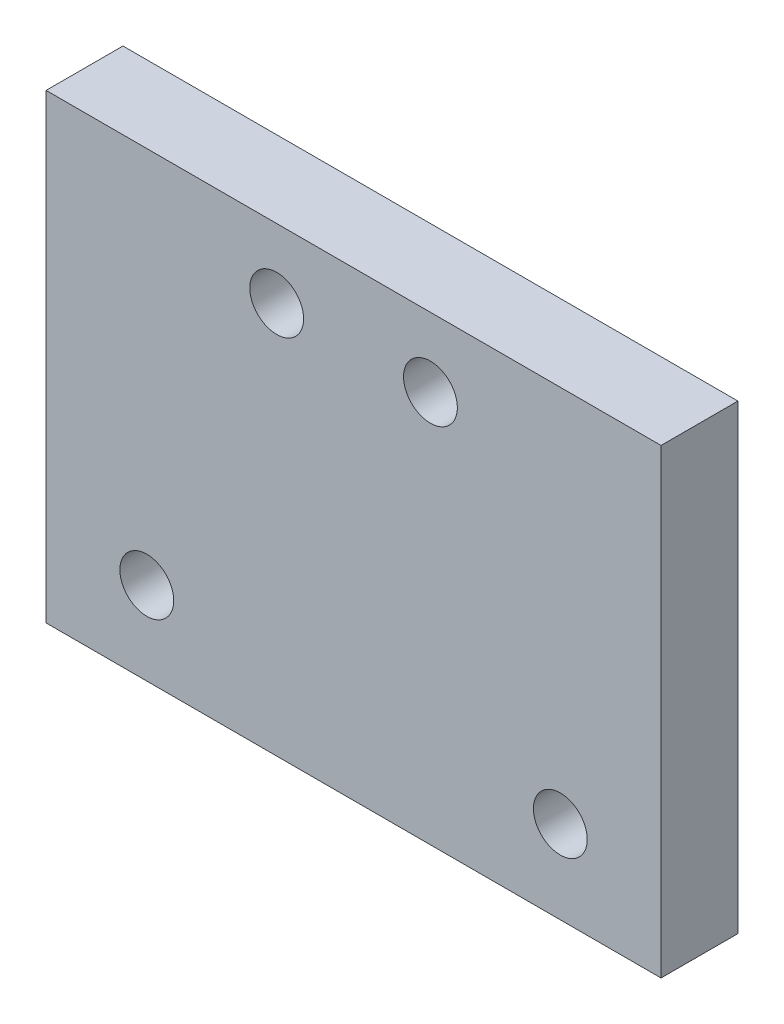
ISO-10303-21;
HEADER;
FILE_DESCRIPTION(('STEP AP214'),'2;1');
FILE_NAME('part.step','',(''),(''),'','','');
FILE_SCHEMA(('AUTOMOTIVE_DESIGN { 1 0 10303 214 1 1 1 1 }'));
ENDSEC;
DATA;
#1=APPLICATION_CONTEXT('core data for automotive mechanical design processes');
#2=APPLICATION_PROTOCOL_DEFINITION('international standard','automotive_design',2000,#1);
#3=PRODUCT_CONTEXT('',#1,'mechanical');
#4=PRODUCT('Part','Part','',(#3));
#5=PRODUCT_RELATED_PRODUCT_CATEGORY('part','',(#4));
#6=PRODUCT_DEFINITION_FORMATION('','',#4);
#7=PRODUCT_DEFINITION_CONTEXT('part definition',#1,'design');
#8=PRODUCT_DEFINITION('design','',#6,#7);
#9=PRODUCT_DEFINITION_SHAPE('','',#8);
#10=(LENGTH_UNIT() NAMED_UNIT(*) SI_UNIT(.MILLI.,.METRE.));
#11=(NAMED_UNIT(*) PLANE_ANGLE_UNIT() SI_UNIT($,.RADIAN.));
#12=(NAMED_UNIT(*) SI_UNIT($,.STERADIAN.) SOLID_ANGLE_UNIT());
#13=UNCERTAINTY_MEASURE_WITH_UNIT(LENGTH_MEASURE(1.E-05),#10,'distance_accuracy_value','');
#14=(GEOMETRIC_REPRESENTATION_CONTEXT(3) GLOBAL_UNCERTAINTY_ASSIGNED_CONTEXT((#13)) GLOBAL_UNIT_ASSIGNED_CONTEXT((#10,
#11,#12)) REPRESENTATION_CONTEXT('',''));
#15=CARTESIAN_POINT('',(0.,0.,0.));
#16=DIRECTION('',(0.,0.,1.));
#17=DIRECTION('',(1.,0.,0.));
#18=AXIS2_PLACEMENT_3D('',#15,#16,#17);
#19=CARTESIAN_POINT('',(0.,0.,-5.));
#20=DIRECTION('',(-1.,0.,0.));
#21=DIRECTION('',(0.,0.,1.));
#22=AXIS2_PLACEMENT_3D('',#19,#20,#21);
#23=PLANE('',#22);
#24=DIRECTION('',(0.,-1.,0.));
#25=VECTOR('',#24,1.);
#26=CARTESIAN_POINT('',(0.,0.,0.));
#27=LINE('',#26,#25);
#28=CARTESIAN_POINT('',(0.,30.,0.));
#29=VERTEX_POINT('',#28);
#30=CARTESIAN_POINT('',(0.,0.,0.));
#31=VERTEX_POINT('',#30);
#32=EDGE_CURVE('E101',#29,#31,#27,.T.);
#33=ORIENTED_EDGE('',*,*,#32,.F.);
#34=DIRECTION('',(0.,0.,1.));
#35=VECTOR('',#34,1.);
#36=CARTESIAN_POINT('',(0.,30.,-5.));
#37=LINE('',#36,#35);
#38=CARTESIAN_POINT('',(0.,30.,-5.));
#39=VERTEX_POINT('',#38);
#40=EDGE_CURVE('E11',#39,#29,#37,.T.);
#41=ORIENTED_EDGE('',*,*,#40,.F.);
#42=DIRECTION('',(0.,-1.,0.));
#43=VECTOR('',#42,1.);
#44=CARTESIAN_POINT('',(0.,0.,-5.));
#45=LINE('',#44,#43);
#46=CARTESIAN_POINT('',(0.,0.,-5.));
#47=VERTEX_POINT('',#46);
#48=EDGE_CURVE('E100',#39,#47,#45,.T.);
#49=ORIENTED_EDGE('',*,*,#48,.T.);
#50=DIRECTION('',(0.,0.,1.));
#51=VECTOR('',#50,1.);
#52=CARTESIAN_POINT('',(0.,0.,-5.));
#53=LINE('',#52,#51);
#54=EDGE_CURVE('E45',#47,#31,#53,.T.);
#55=ORIENTED_EDGE('',*,*,#54,.T.);
#56=EDGE_LOOP('',(#33,#41,#49,#55));
#57=FACE_BOUND('',#56,.T.);
#58=ADVANCED_FACE('F39',(#57),#23,.T.);
#59=CARTESIAN_POINT('',(0.,30.,-5.));
#60=DIRECTION('',(0.,1.,0.));
#61=DIRECTION('',(0.,0.,1.));
#62=AXIS2_PLACEMENT_3D('',#59,#60,#61);
#63=PLANE('',#62);
#64=DIRECTION('',(-1.,0.,0.));
#65=VECTOR('',#64,1.);
#66=CARTESIAN_POINT('',(0.,30.,0.));
#67=LINE('',#66,#65);
#68=CARTESIAN_POINT('',(40.,30.,0.));
#69=VERTEX_POINT('',#68);
#70=EDGE_CURVE('E98',#69,#29,#67,.T.);
#71=ORIENTED_EDGE('',*,*,#70,.F.);
#72=DIRECTION('',(0.,0.,1.));
#73=VECTOR('',#72,1.);
#74=CARTESIAN_POINT('',(40.,30.,-5.));
#75=LINE('',#74,#73);
#76=CARTESIAN_POINT('',(40.,30.,-5.));
#77=VERTEX_POINT('',#76);
#78=EDGE_CURVE('E48',#77,#69,#75,.T.);
#79=ORIENTED_EDGE('',*,*,#78,.F.);
#80=DIRECTION('',(-1.,0.,0.));
#81=VECTOR('',#80,1.);
#82=CARTESIAN_POINT('',(0.,30.,-5.));
#83=LINE('',#82,#81);
#84=EDGE_CURVE('E92',#77,#39,#83,.T.);
#85=ORIENTED_EDGE('',*,*,#84,.T.);
#86=ORIENTED_EDGE('',*,*,#40,.T.);
#87=EDGE_LOOP('',(#71,#79,#85,#86));
#88=FACE_BOUND('',#87,.T.);
#89=ADVANCED_FACE('F113',(#88),#63,.T.);
#90=CARTESIAN_POINT('',(40.,0.,-5.));
#91=DIRECTION('',(1.,0.,0.));
#92=DIRECTION('',(0.,0.,-1.));
#93=AXIS2_PLACEMENT_3D('',#90,#91,#92);
#94=PLANE('',#93);
#95=DIRECTION('',(0.,1.,0.));
#96=VECTOR('',#95,1.);
#97=CARTESIAN_POINT('',(40.,0.,0.));
#98=LINE('',#97,#96);
#99=CARTESIAN_POINT('',(40.,0.,0.));
#100=VERTEX_POINT('',#99);
#101=EDGE_CURVE('E87',#100,#69,#98,.T.);
#102=ORIENTED_EDGE('',*,*,#101,.F.);
#103=DIRECTION('',(0.,0.,1.));
#104=VECTOR('',#103,1.);
#105=CARTESIAN_POINT('',(40.,0.,-5.));
#106=LINE('',#105,#104);
#107=CARTESIAN_POINT('',(40.,0.,-5.));
#108=VERTEX_POINT('',#107);
#109=EDGE_CURVE('E84',#108,#100,#106,.T.);
#110=ORIENTED_EDGE('',*,*,#109,.F.);
#111=DIRECTION('',(0.,1.,0.));
#112=VECTOR('',#111,1.);
#113=CARTESIAN_POINT('',(40.,0.,-5.));
#114=LINE('',#113,#112);
#115=EDGE_CURVE('E90',#108,#77,#114,.T.);
#116=ORIENTED_EDGE('',*,*,#115,.T.);
#117=ORIENTED_EDGE('',*,*,#78,.T.);
#118=EDGE_LOOP('',(#102,#110,#116,#117));
#119=FACE_BOUND('',#118,.T.);
#120=ADVANCED_FACE('F86',(#119),#94,.T.);
#121=CARTESIAN_POINT('',(0.,0.,-5.));
#122=DIRECTION('',(0.,-1.,0.));
#123=DIRECTION('',(0.,0.,-1.));
#124=AXIS2_PLACEMENT_3D('',#121,#122,#123);
#125=PLANE('',#124);
#126=DIRECTION('',(1.,0.,0.));
#127=VECTOR('',#126,1.);
#128=CARTESIAN_POINT('',(0.,0.,0.));
#129=LINE('',#128,#127);
#130=EDGE_CURVE('E107',#31,#100,#129,.T.);
#131=ORIENTED_EDGE('',*,*,#130,.F.);
#132=ORIENTED_EDGE('',*,*,#54,.F.);
#133=DIRECTION('',(1.,0.,0.));
#134=VECTOR('',#133,1.);
#135=CARTESIAN_POINT('',(0.,0.,-5.));
#136=LINE('',#135,#134);
#137=EDGE_CURVE('E93',#47,#108,#136,.T.);
#138=ORIENTED_EDGE('',*,*,#137,.T.);
#139=ORIENTED_EDGE('',*,*,#109,.T.);
#140=EDGE_LOOP('',(#131,#132,#138,#139));
#141=FACE_BOUND('',#140,.T.);
#142=ADVANCED_FACE('F96',(#141),#125,.T.);
#143=CARTESIAN_POINT('',(0.,0.,-5.));
#144=DIRECTION('',(0.,0.,-1.));
#145=DIRECTION('',(-1.,0.,0.));
#146=AXIS2_PLACEMENT_3D('',#143,#144,#145);
#147=PLANE('',#146);
#148=CARTESIAN_POINT('',(33.45,5.40000000000001,-5.));
#149=DIRECTION('',(0.,0.,1.));
#150=DIRECTION('',(-1.,0.,0.));
#151=AXIS2_PLACEMENT_3D('',#148,#149,#150);
#152=CIRCLE('',#151,1.75);
#153=CARTESIAN_POINT('',(31.7,5.40000000000001,-5.));
#154=VERTEX_POINT('',#153);
#155=EDGE_CURVE('E157',#154,#154,#152,.T.);
#156=ORIENTED_EDGE('',*,*,#155,.T.);
#157=EDGE_LOOP('',(#156));
#158=FACE_BOUND('',#157,.T.);
#159=CARTESIAN_POINT('',(6.55,5.4,-5.));
#160=DIRECTION('',(0.,0.,1.));
#161=DIRECTION('',(1.,0.,0.));
#162=AXIS2_PLACEMENT_3D('',#159,#160,#161);
#163=CIRCLE('',#162,1.75);
#164=CARTESIAN_POINT('',(8.30000000000001,5.4,-5.));
#165=VERTEX_POINT('',#164);
#166=EDGE_CURVE('E163',#165,#165,#163,.T.);
#167=ORIENTED_EDGE('',*,*,#166,.T.);
#168=EDGE_LOOP('',(#167));
#169=FACE_BOUND('',#168,.T.);
#170=CARTESIAN_POINT('',(25.,25.5,-5.));
#171=DIRECTION('',(0.,0.,1.));
#172=DIRECTION('',(-1.,0.,0.));
#173=AXIS2_PLACEMENT_3D('',#170,#171,#172);
#174=CIRCLE('',#173,1.75);
#175=CARTESIAN_POINT('',(23.25,25.5,-5.));
#176=VERTEX_POINT('',#175);
#177=EDGE_CURVE('E169',#176,#176,#174,.T.);
#178=ORIENTED_EDGE('',*,*,#177,.T.);
#179=EDGE_LOOP('',(#178));
#180=FACE_BOUND('',#179,.T.);
#181=CARTESIAN_POINT('',(15.,25.5,-5.));
#182=DIRECTION('',(0.,0.,1.));
#183=DIRECTION('',(1.,0.,0.));
#184=AXIS2_PLACEMENT_3D('',#181,#182,#183);
#185=CIRCLE('',#184,1.75);
#186=CARTESIAN_POINT('',(16.75,25.5,-5.));
#187=VERTEX_POINT('',#186);
#188=EDGE_CURVE('E109',#187,#187,#185,.T.);
#189=ORIENTED_EDGE('',*,*,#188,.T.);
#190=EDGE_LOOP('',(#189));
#191=FACE_BOUND('',#190,.T.);
#192=ORIENTED_EDGE('',*,*,#48,.F.);
#193=ORIENTED_EDGE('',*,*,#84,.F.);
#194=ORIENTED_EDGE('',*,*,#115,.F.);
#195=ORIENTED_EDGE('',*,*,#137,.F.);
#196=EDGE_LOOP('',(#192,#193,#194,#195));
#197=FACE_BOUND('',#196,.T.);
#198=ADVANCED_FACE('F95',(#158,#169,#180,#191,#197),#147,.T.);
#199=CARTESIAN_POINT('',(0.,0.,0.));
#200=DIRECTION('',(0.,0.,-1.));
#201=DIRECTION('',(-1.,0.,0.));
#202=AXIS2_PLACEMENT_3D('',#199,#200,#201);
#203=PLANE('',#202);
#204=CARTESIAN_POINT('',(33.45,5.40000000000001,0.));
#205=DIRECTION('',(0.,0.,1.));
#206=DIRECTION('',(-1.,0.,0.));
#207=AXIS2_PLACEMENT_3D('',#204,#205,#206);
#208=CIRCLE('',#207,1.75);
#209=CARTESIAN_POINT('',(31.7,5.40000000000001,0.));
#210=VERTEX_POINT('',#209);
#211=EDGE_CURVE('E159',#210,#210,#208,.T.);
#212=ORIENTED_EDGE('',*,*,#211,.F.);
#213=EDGE_LOOP('',(#212));
#214=FACE_BOUND('',#213,.T.);
#215=CARTESIAN_POINT('',(6.55,5.4,0.));
#216=DIRECTION('',(0.,0.,1.));
#217=DIRECTION('',(1.,0.,0.));
#218=AXIS2_PLACEMENT_3D('',#215,#216,#217);
#219=CIRCLE('',#218,1.75);
#220=CARTESIAN_POINT('',(8.30000000000001,5.4,0.));
#221=VERTEX_POINT('',#220);
#222=EDGE_CURVE('E161',#221,#221,#219,.T.);
#223=ORIENTED_EDGE('',*,*,#222,.F.);
#224=EDGE_LOOP('',(#223));
#225=FACE_BOUND('',#224,.T.);
#226=CARTESIAN_POINT('',(25.,25.5,0.));
#227=DIRECTION('',(0.,0.,1.));
#228=DIRECTION('',(-1.,0.,0.));
#229=AXIS2_PLACEMENT_3D('',#226,#227,#228);
#230=CIRCLE('',#229,1.75);
#231=CARTESIAN_POINT('',(23.25,25.5,0.));
#232=VERTEX_POINT('',#231);
#233=EDGE_CURVE('E167',#232,#232,#230,.T.);
#234=ORIENTED_EDGE('',*,*,#233,.F.);
#235=EDGE_LOOP('',(#234));
#236=FACE_BOUND('',#235,.T.);
#237=CARTESIAN_POINT('',(15.,25.5,0.));
#238=DIRECTION('',(0.,0.,1.));
#239=DIRECTION('',(1.,0.,0.));
#240=AXIS2_PLACEMENT_3D('',#237,#238,#239);
#241=CIRCLE('',#240,1.75);
#242=CARTESIAN_POINT('',(16.75,25.5,0.));
#243=VERTEX_POINT('',#242);
#244=EDGE_CURVE('E171',#243,#243,#241,.T.);
#245=ORIENTED_EDGE('',*,*,#244,.F.);
#246=EDGE_LOOP('',(#245));
#247=FACE_BOUND('',#246,.T.);
#248=ORIENTED_EDGE('',*,*,#32,.T.);
#249=ORIENTED_EDGE('',*,*,#130,.T.);
#250=ORIENTED_EDGE('',*,*,#101,.T.);
#251=ORIENTED_EDGE('',*,*,#70,.T.);
#252=EDGE_LOOP('',(#248,#249,#250,#251));
#253=FACE_BOUND('',#252,.T.);
#254=ADVANCED_FACE('F114',(#214,#225,#236,#247,#253),#203,.F.);
#255=CARTESIAN_POINT('',(15.,25.5,-5.));
#256=DIRECTION('',(0.,0.,1.));
#257=DIRECTION('',(1.,0.,0.));
#258=AXIS2_PLACEMENT_3D('',#255,#256,#257);
#259=CYLINDRICAL_SURFACE('',#258,1.75);
#260=ORIENTED_EDGE('',*,*,#188,.F.);
#261=EDGE_LOOP('',(#260));
#262=FACE_BOUND('',#261,.T.);
#263=ORIENTED_EDGE('',*,*,#244,.T.);
#264=EDGE_LOOP('',(#263));
#265=FACE_BOUND('',#264,.T.);
#266=ADVANCED_FACE('F133',(#262,#265),#259,.F.);
#267=CARTESIAN_POINT('',(25.,25.5,-5.));
#268=DIRECTION('',(0.,0.,1.));
#269=DIRECTION('',(1.,0.,0.));
#270=AXIS2_PLACEMENT_3D('',#267,#268,#269);
#271=CYLINDRICAL_SURFACE('',#270,1.75);
#272=ORIENTED_EDGE('',*,*,#177,.F.);
#273=EDGE_LOOP('',(#272));
#274=FACE_BOUND('',#273,.T.);
#275=ORIENTED_EDGE('',*,*,#233,.T.);
#276=EDGE_LOOP('',(#275));
#277=FACE_BOUND('',#276,.T.);
#278=ADVANCED_FACE('F139',(#274,#277),#271,.F.);
#279=CARTESIAN_POINT('',(6.55,5.4,-5.));
#280=DIRECTION('',(0.,0.,1.));
#281=DIRECTION('',(1.,0.,0.));
#282=AXIS2_PLACEMENT_3D('',#279,#280,#281);
#283=CYLINDRICAL_SURFACE('',#282,1.75);
#284=ORIENTED_EDGE('',*,*,#166,.F.);
#285=EDGE_LOOP('',(#284));
#286=FACE_BOUND('',#285,.T.);
#287=ORIENTED_EDGE('',*,*,#222,.T.);
#288=EDGE_LOOP('',(#287));
#289=FACE_BOUND('',#288,.T.);
#290=ADVANCED_FACE('F143',(#286,#289),#283,.F.);
#291=CARTESIAN_POINT('',(33.45,5.40000000000001,-5.));
#292=DIRECTION('',(0.,0.,1.));
#293=DIRECTION('',(1.,0.,0.));
#294=AXIS2_PLACEMENT_3D('',#291,#292,#293);
#295=CYLINDRICAL_SURFACE('',#294,1.75);
#296=ORIENTED_EDGE('',*,*,#155,.F.);
#297=EDGE_LOOP('',(#296));
#298=FACE_BOUND('',#297,.T.);
#299=ORIENTED_EDGE('',*,*,#211,.T.);
#300=EDGE_LOOP('',(#299));
#301=FACE_BOUND('',#300,.T.);
#302=ADVANCED_FACE('F149',(#298,#301),#295,.F.);
#303=CLOSED_SHELL('',(#58,#89,#120,#142,#198,#254,#266,#278,#290,#302));
#304=MANIFOLD_SOLID_BREP('B2',#303);
#305=ADVANCED_BREP_SHAPE_REPRESENTATION('',(#18,#304),#14);
#306=SHAPE_DEFINITION_REPRESENTATION(#9,#305);
ENDSEC;
END-ISO-10303-21;
